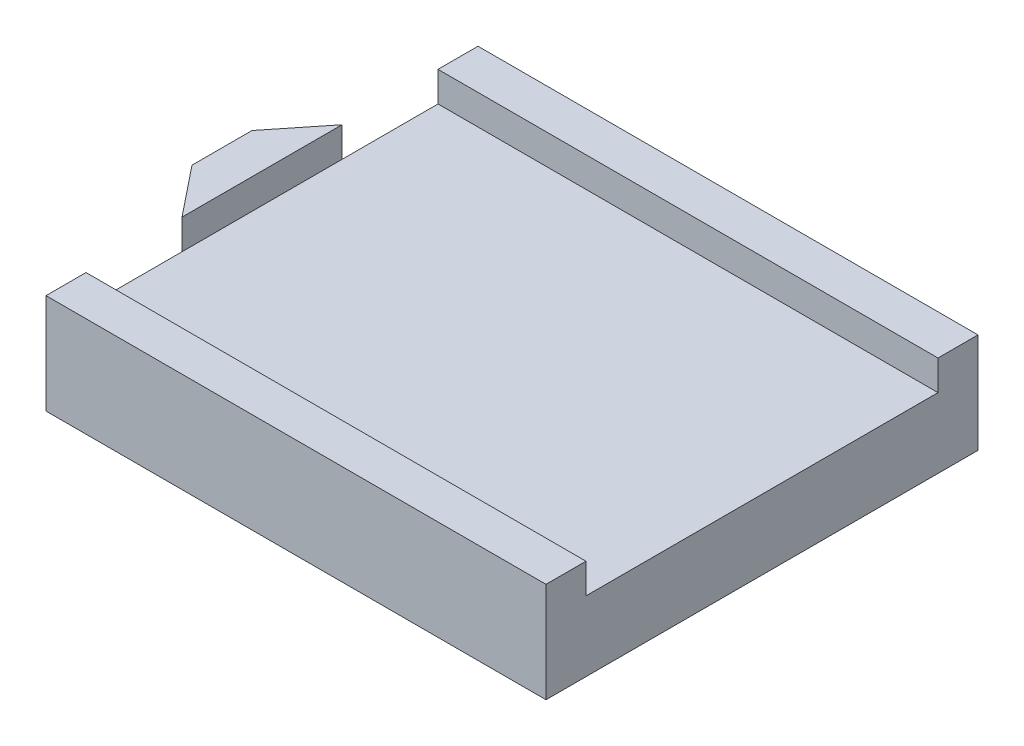
ISO-10303-21;
HEADER;
FILE_DESCRIPTION(('STEP AP214'),'2;1');
FILE_NAME('part.step','',(''),(''),'','','');
FILE_SCHEMA(('AUTOMOTIVE_DESIGN { 1 0 10303 214 1 1 1 1 }'));
ENDSEC;
DATA;
#1=APPLICATION_CONTEXT('core data for automotive mechanical design processes');
#2=APPLICATION_PROTOCOL_DEFINITION('international standard','automotive_design',2000,#1);
#3=PRODUCT_CONTEXT('',#1,'mechanical');
#4=PRODUCT('Part','Part','',(#3));
#5=PRODUCT_RELATED_PRODUCT_CATEGORY('part','',(#4));
#6=PRODUCT_DEFINITION_FORMATION('','',#4);
#7=PRODUCT_DEFINITION_CONTEXT('part definition',#1,'design');
#8=PRODUCT_DEFINITION('design','',#6,#7);
#9=PRODUCT_DEFINITION_SHAPE('','',#8);
#10=(LENGTH_UNIT() NAMED_UNIT(*) SI_UNIT(.MILLI.,.METRE.));
#11=(NAMED_UNIT(*) PLANE_ANGLE_UNIT() SI_UNIT($,.RADIAN.));
#12=(NAMED_UNIT(*) SI_UNIT($,.STERADIAN.) SOLID_ANGLE_UNIT());
#13=UNCERTAINTY_MEASURE_WITH_UNIT(LENGTH_MEASURE(1.E-05),#10,'distance_accuracy_value','');
#14=(GEOMETRIC_REPRESENTATION_CONTEXT(3) GLOBAL_UNCERTAINTY_ASSIGNED_CONTEXT((#13)) GLOBAL_UNIT_ASSIGNED_CONTEXT((#10,
#11,#12)) REPRESENTATION_CONTEXT('',''));
#15=CARTESIAN_POINT('',(0.,0.,0.));
#16=DIRECTION('',(0.,0.,1.));
#17=DIRECTION('',(1.,0.,0.));
#18=AXIS2_PLACEMENT_3D('',#15,#16,#17);
#19=CARTESIAN_POINT('',(-12.5,3.5,0.));
#20=DIRECTION('',(-1.,0.,0.));
#21=DIRECTION('',(0.,0.,1.));
#22=AXIS2_PLACEMENT_3D('',#19,#20,#21);
#23=PLANE('',#22);
#24=DIRECTION('',(0.,0.,-1.));
#25=VECTOR('',#24,1.);
#26=CARTESIAN_POINT('',(-12.5,3.5,0.));
#27=LINE('',#26,#25);
#28=CARTESIAN_POINT('',(-12.5,3.5,8.8));
#29=VERTEX_POINT('',#28);
#30=CARTESIAN_POINT('',(-12.5,3.5,4.));
#31=VERTEX_POINT('',#30);
#32=EDGE_CURVE('E262',#29,#31,#27,.T.);
#33=ORIENTED_EDGE('',*,*,#32,.T.);
#34=DIRECTION('',(0.,-1.,0.));
#35=VECTOR('',#34,1.);
#36=CARTESIAN_POINT('',(-12.5,5.,4.));
#37=LINE('',#36,#35);
#38=CARTESIAN_POINT('',(-12.5,0.,4.));
#39=VERTEX_POINT('',#38);
#40=EDGE_CURVE('E56',#31,#39,#37,.T.);
#41=ORIENTED_EDGE('',*,*,#40,.T.);
#42=DIRECTION('',(0.,0.,-1.));
#43=VECTOR('',#42,1.);
#44=CARTESIAN_POINT('',(-12.5,0.,0.));
#45=LINE('',#44,#43);
#46=CARTESIAN_POINT('',(-12.5,0.,10.8));
#47=VERTEX_POINT('',#46);
#48=EDGE_CURVE('E278',#47,#39,#45,.T.);
#49=ORIENTED_EDGE('',*,*,#48,.F.);
#50=DIRECTION('',(0.,-1.,0.));
#51=VECTOR('',#50,1.);
#52=CARTESIAN_POINT('',(-12.5,5.,10.8));
#53=LINE('',#52,#51);
#54=CARTESIAN_POINT('',(-12.5,5.,10.8));
#55=VERTEX_POINT('',#54);
#56=EDGE_CURVE('E253',#55,#47,#53,.T.);
#57=ORIENTED_EDGE('',*,*,#56,.F.);
#58=DIRECTION('',(0.,0.,-1.));
#59=VECTOR('',#58,1.);
#60=CARTESIAN_POINT('',(-12.5,5.,0.));
#61=LINE('',#60,#59);
#62=CARTESIAN_POINT('',(-12.5,5.,8.8));
#63=VERTEX_POINT('',#62);
#64=EDGE_CURVE('E232',#55,#63,#61,.T.);
#65=ORIENTED_EDGE('',*,*,#64,.T.);
#66=DIRECTION('',(0.,-1.,0.));
#67=VECTOR('',#66,1.);
#68=CARTESIAN_POINT('',(-12.5,5.,8.8));
#69=LINE('',#68,#67);
#70=EDGE_CURVE('E257',#63,#29,#69,.T.);
#71=ORIENTED_EDGE('',*,*,#70,.T.);
#72=EDGE_LOOP('',(#33,#41,#49,#57,#65,#71));
#73=FACE_BOUND('',#72,.T.);
#74=ADVANCED_FACE('F46',(#73),#23,.T.);
#75=DIRECTION('',(0.,-1.,0.));
#76=VECTOR('',#75,1.);
#77=CARTESIAN_POINT('',(-12.5,5.,-4.));
#78=LINE('',#77,#76);
#79=CARTESIAN_POINT('',(-12.5,3.5,-4.));
#80=VERTEX_POINT('',#79);
#81=CARTESIAN_POINT('',(-12.5,0.,-4.));
#82=VERTEX_POINT('',#81);
#83=EDGE_CURVE('E11',#80,#82,#78,.T.);
#84=ORIENTED_EDGE('',*,*,#83,.F.);
#85=CARTESIAN_POINT('',(-12.5,3.5,-8.8));
#86=VERTEX_POINT('',#85);
#87=EDGE_CURVE('E73',#80,#86,#27,.T.);
#88=ORIENTED_EDGE('',*,*,#87,.T.);
#89=DIRECTION('',(0.,-1.,0.));
#90=VECTOR('',#89,1.);
#91=CARTESIAN_POINT('',(-12.5,5.,-8.8));
#92=LINE('',#91,#90);
#93=CARTESIAN_POINT('',(-12.5,5.,-8.8));
#94=VERTEX_POINT('',#93);
#95=EDGE_CURVE('E224',#94,#86,#92,.T.);
#96=ORIENTED_EDGE('',*,*,#95,.F.);
#97=DIRECTION('',(0.,0.,-1.));
#98=VECTOR('',#97,1.);
#99=CARTESIAN_POINT('',(-12.5,5.,0.));
#100=LINE('',#99,#98);
#101=CARTESIAN_POINT('',(-12.5,5.,-10.8));
#102=VERTEX_POINT('',#101);
#103=EDGE_CURVE('E195',#94,#102,#100,.T.);
#104=ORIENTED_EDGE('',*,*,#103,.T.);
#105=DIRECTION('',(0.,-1.,0.));
#106=VECTOR('',#105,1.);
#107=CARTESIAN_POINT('',(-12.5,5.,-10.8));
#108=LINE('',#107,#106);
#109=CARTESIAN_POINT('',(-12.5,0.,-10.8));
#110=VERTEX_POINT('',#109);
#111=EDGE_CURVE('E209',#102,#110,#108,.T.);
#112=ORIENTED_EDGE('',*,*,#111,.T.);
#113=EDGE_CURVE('E261',#82,#110,#45,.T.);
#114=ORIENTED_EDGE('',*,*,#113,.F.);
#115=EDGE_LOOP('',(#84,#88,#96,#104,#112,#114));
#116=FACE_BOUND('',#115,.T.);
#117=ADVANCED_FACE('F48',(#116),#23,.T.);
#118=CARTESIAN_POINT('',(12.5,3.5,0.));
#119=DIRECTION('',(-1.,0.,0.));
#120=DIRECTION('',(0.,0.,1.));
#121=AXIS2_PLACEMENT_3D('',#118,#119,#120);
#122=PLANE('',#121);
#123=DIRECTION('',(0.,0.,-1.));
#124=VECTOR('',#123,1.);
#125=CARTESIAN_POINT('',(12.5,0.,0.));
#126=LINE('',#125,#124);
#127=CARTESIAN_POINT('',(12.5,0.,10.8));
#128=VERTEX_POINT('',#127);
#129=CARTESIAN_POINT('',(12.5,0.,-10.8));
#130=VERTEX_POINT('',#129);
#131=EDGE_CURVE('E50',#128,#130,#126,.T.);
#132=ORIENTED_EDGE('',*,*,#131,.T.);
#133=DIRECTION('',(0.,-1.,0.));
#134=VECTOR('',#133,1.);
#135=CARTESIAN_POINT('',(12.5,5.,-10.8));
#136=LINE('',#135,#134);
#137=CARTESIAN_POINT('',(12.5,5.,-10.8));
#138=VERTEX_POINT('',#137);
#139=EDGE_CURVE('E216',#138,#130,#136,.T.);
#140=ORIENTED_EDGE('',*,*,#139,.F.);
#141=DIRECTION('',(0.,0.,-1.));
#142=VECTOR('',#141,1.);
#143=CARTESIAN_POINT('',(12.5,5.,0.));
#144=LINE('',#143,#142);
#145=CARTESIAN_POINT('',(12.5,5.,-8.8));
#146=VERTEX_POINT('',#145);
#147=EDGE_CURVE('E203',#146,#138,#144,.T.);
#148=ORIENTED_EDGE('',*,*,#147,.F.);
#149=DIRECTION('',(0.,-1.,0.));
#150=VECTOR('',#149,1.);
#151=CARTESIAN_POINT('',(12.5,5.,-8.8));
#152=LINE('',#151,#150);
#153=CARTESIAN_POINT('',(12.5,3.5,-8.8));
#154=VERTEX_POINT('',#153);
#155=EDGE_CURVE('E220',#146,#154,#152,.T.);
#156=ORIENTED_EDGE('',*,*,#155,.T.);
#157=DIRECTION('',(0.,0.,-1.));
#158=VECTOR('',#157,1.);
#159=CARTESIAN_POINT('',(12.5,3.5,0.));
#160=LINE('',#159,#158);
#161=CARTESIAN_POINT('',(12.5,3.5,8.8));
#162=VERTEX_POINT('',#161);
#163=EDGE_CURVE('E271',#162,#154,#160,.T.);
#164=ORIENTED_EDGE('',*,*,#163,.F.);
#165=DIRECTION('',(0.,-1.,0.));
#166=VECTOR('',#165,1.);
#167=CARTESIAN_POINT('',(12.5,5.,8.8));
#168=LINE('',#167,#166);
#169=CARTESIAN_POINT('',(12.5,5.,8.8));
#170=VERTEX_POINT('',#169);
#171=EDGE_CURVE('E243',#170,#162,#168,.T.);
#172=ORIENTED_EDGE('',*,*,#171,.F.);
#173=DIRECTION('',(0.,0.,-1.));
#174=VECTOR('',#173,1.);
#175=CARTESIAN_POINT('',(12.5,5.,0.));
#176=LINE('',#175,#174);
#177=CARTESIAN_POINT('',(12.5,5.,10.8));
#178=VERTEX_POINT('',#177);
#179=EDGE_CURVE('E240',#178,#170,#176,.T.);
#180=ORIENTED_EDGE('',*,*,#179,.F.);
#181=DIRECTION('',(0.,-1.,0.));
#182=VECTOR('',#181,1.);
#183=CARTESIAN_POINT('',(12.5,5.,10.8));
#184=LINE('',#183,#182);
#185=EDGE_CURVE('E249',#178,#128,#184,.T.);
#186=ORIENTED_EDGE('',*,*,#185,.T.);
#187=EDGE_LOOP('',(#132,#140,#148,#156,#164,#172,#180,#186));
#188=FACE_BOUND('',#187,.T.);
#189=ADVANCED_FACE('F295',(#188),#122,.F.);
#190=CARTESIAN_POINT('',(0.,3.5,0.));
#191=DIRECTION('',(0.,1.,0.));
#192=DIRECTION('',(0.,0.,1.));
#193=AXIS2_PLACEMENT_3D('',#190,#191,#192);
#194=PLANE('',#193);
#195=ORIENTED_EDGE('',*,*,#32,.F.);
#196=DIRECTION('',(1.,0.,0.));
#197=VECTOR('',#196,1.);
#198=CARTESIAN_POINT('',(0.,3.5,8.8));
#199=LINE('',#198,#197);
#200=EDGE_CURVE('E266',#29,#162,#199,.T.);
#201=ORIENTED_EDGE('',*,*,#200,.T.);
#202=ORIENTED_EDGE('',*,*,#163,.T.);
#203=DIRECTION('',(-1.,0.,0.));
#204=VECTOR('',#203,1.);
#205=CARTESIAN_POINT('',(0.,3.5,-8.8));
#206=LINE('',#205,#204);
#207=EDGE_CURVE('E275',#154,#86,#206,.T.);
#208=ORIENTED_EDGE('',*,*,#207,.T.);
#209=ORIENTED_EDGE('',*,*,#87,.F.);
#210=EDGE_CURVE('E267',#31,#80,#27,.T.);
#211=ORIENTED_EDGE('',*,*,#210,.F.);
#212=EDGE_LOOP('',(#195,#201,#202,#208,#209,#211));
#213=FACE_BOUND('',#212,.T.);
#214=ADVANCED_FACE('F313',(#213),#194,.T.);
#215=CARTESIAN_POINT('',(0.,0.,0.));
#216=DIRECTION('',(0.,1.,0.));
#217=DIRECTION('',(0.,0.,1.));
#218=AXIS2_PLACEMENT_3D('',#215,#216,#217);
#219=PLANE('',#218);
#220=CARTESIAN_POINT('',(8.50000000000002,0.,-7.8));
#221=DIRECTION('',(0.,-1.,0.));
#222=DIRECTION('',(0.,0.,1.));
#223=AXIS2_PLACEMENT_3D('',#220,#221,#222);
#224=CIRCLE('',#223,1.55);
#225=CARTESIAN_POINT('',(8.50000000000002,0.,-6.25));
#226=VERTEX_POINT('',#225);
#227=EDGE_CURVE('E426',#226,#226,#224,.T.);
#228=ORIENTED_EDGE('',*,*,#227,.F.);
#229=EDGE_LOOP('',(#228));
#230=FACE_BOUND('',#229,.T.);
#231=CARTESIAN_POINT('',(-8.49999999999999,0.,-7.80000000000003));
#232=DIRECTION('',(0.,-1.,0.));
#233=DIRECTION('',(0.,0.,-1.));
#234=AXIS2_PLACEMENT_3D('',#231,#232,#233);
#235=CIRCLE('',#234,1.55);
#236=CARTESIAN_POINT('',(-8.49999999999999,0.,-9.35000000000002));
#237=VERTEX_POINT('',#236);
#238=EDGE_CURVE('E416',#237,#237,#235,.T.);
#239=ORIENTED_EDGE('',*,*,#238,.F.);
#240=EDGE_LOOP('',(#239));
#241=FACE_BOUND('',#240,.T.);
#242=CARTESIAN_POINT('',(-8.49999999999999,0.,7.80000000000002));
#243=DIRECTION('',(0.,-1.,0.));
#244=DIRECTION('',(0.,0.,1.));
#245=AXIS2_PLACEMENT_3D('',#242,#243,#244);
#246=CIRCLE('',#245,1.55);
#247=CARTESIAN_POINT('',(-8.49999999999999,0.,9.35000000000002));
#248=VERTEX_POINT('',#247);
#249=EDGE_CURVE('E408',#248,#248,#246,.T.);
#250=ORIENTED_EDGE('',*,*,#249,.F.);
#251=EDGE_LOOP('',(#250));
#252=FACE_BOUND('',#251,.T.);
#253=CARTESIAN_POINT('',(8.50000000000001,0.,7.80000000000001));
#254=DIRECTION('',(0.,-1.,0.));
#255=DIRECTION('',(0.,0.,-1.));
#256=AXIS2_PLACEMENT_3D('',#253,#254,#255);
#257=CIRCLE('',#256,1.55);
#258=CARTESIAN_POINT('',(8.50000000000001,0.,6.25000000000001));
#259=VERTEX_POINT('',#258);
#260=EDGE_CURVE('E411',#259,#259,#257,.T.);
#261=ORIENTED_EDGE('',*,*,#260,.F.);
#262=EDGE_LOOP('',(#261));
#263=FACE_BOUND('',#262,.T.);
#264=ORIENTED_EDGE('',*,*,#48,.T.);
#265=DIRECTION('',(0.624695047554424,0.,0.78086880944303));
#266=VECTOR('',#265,1.);
#267=CARTESIAN_POINT('',(-9.57317073170731,0.,7.65853658536585));
#268=LINE('',#267,#266);
#269=CARTESIAN_POINT('',(-14.5,0.,1.5));
#270=VERTEX_POINT('',#269);
#271=EDGE_CURVE('E65',#270,#39,#268,.T.);
#272=ORIENTED_EDGE('',*,*,#271,.F.);
#273=DIRECTION('',(0.,0.,-1.));
#274=VECTOR('',#273,1.);
#275=CARTESIAN_POINT('',(-14.5,0.,0.));
#276=LINE('',#275,#274);
#277=CARTESIAN_POINT('',(-14.5,0.,-1.5));
#278=VERTEX_POINT('',#277);
#279=EDGE_CURVE('E182',#270,#278,#276,.T.);
#280=ORIENTED_EDGE('',*,*,#279,.T.);
#281=DIRECTION('',(0.624695047554424,0.,-0.78086880944303));
#282=VECTOR('',#281,1.);
#283=CARTESIAN_POINT('',(-9.57317073170731,0.,-7.65853658536585));
#284=LINE('',#283,#282);
#285=EDGE_CURVE('E151',#278,#82,#284,.T.);
#286=ORIENTED_EDGE('',*,*,#285,.T.);
#287=ORIENTED_EDGE('',*,*,#113,.T.);
#288=DIRECTION('',(-1.,0.,0.));
#289=VECTOR('',#288,1.);
#290=CARTESIAN_POINT('',(0.,0.,-10.8));
#291=LINE('',#290,#289);
#292=EDGE_CURVE('E157',#130,#110,#291,.T.);
#293=ORIENTED_EDGE('',*,*,#292,.F.);
#294=ORIENTED_EDGE('',*,*,#131,.F.);
#295=DIRECTION('',(-1.,0.,0.));
#296=VECTOR('',#295,1.);
#297=CARTESIAN_POINT('',(0.,0.,10.8));
#298=LINE('',#297,#296);
#299=EDGE_CURVE('E227',#128,#47,#298,.T.);
#300=ORIENTED_EDGE('',*,*,#299,.T.);
#301=EDGE_LOOP('',(#264,#272,#280,#286,#287,#293,#294,#300));
#302=FACE_BOUND('',#301,.T.);
#303=ADVANCED_FACE('F286',(#230,#241,#252,#263,#302),#219,.F.);
#304=CARTESIAN_POINT('',(0.,5.,8.8));
#305=DIRECTION('',(0.,0.,-1.));
#306=DIRECTION('',(-1.,0.,0.));
#307=AXIS2_PLACEMENT_3D('',#304,#305,#306);
#308=PLANE('',#307);
#309=ORIENTED_EDGE('',*,*,#200,.F.);
#310=ORIENTED_EDGE('',*,*,#70,.F.);
#311=DIRECTION('',(1.,0.,0.));
#312=VECTOR('',#311,1.);
#313=CARTESIAN_POINT('',(0.,5.,8.8));
#314=LINE('',#313,#312);
#315=EDGE_CURVE('E228',#63,#170,#314,.T.);
#316=ORIENTED_EDGE('',*,*,#315,.T.);
#317=ORIENTED_EDGE('',*,*,#171,.T.);
#318=EDGE_LOOP('',(#309,#310,#316,#317));
#319=FACE_BOUND('',#318,.T.);
#320=ADVANCED_FACE('F309',(#319),#308,.T.);
#321=CARTESIAN_POINT('',(0.,5.,10.8));
#322=DIRECTION('',(0.,0.,1.));
#323=DIRECTION('',(1.,0.,0.));
#324=AXIS2_PLACEMENT_3D('',#321,#322,#323);
#325=PLANE('',#324);
#326=ORIENTED_EDGE('',*,*,#299,.F.);
#327=ORIENTED_EDGE('',*,*,#185,.F.);
#328=DIRECTION('',(-1.,0.,0.));
#329=VECTOR('',#328,1.);
#330=CARTESIAN_POINT('',(0.,5.,10.8));
#331=LINE('',#330,#329);
#332=EDGE_CURVE('E236',#178,#55,#331,.T.);
#333=ORIENTED_EDGE('',*,*,#332,.T.);
#334=ORIENTED_EDGE('',*,*,#56,.T.);
#335=EDGE_LOOP('',(#326,#327,#333,#334));
#336=FACE_BOUND('',#335,.T.);
#337=ADVANCED_FACE('F300',(#336),#325,.T.);
#338=CARTESIAN_POINT('',(0.,5.,0.));
#339=DIRECTION('',(0.,1.,0.));
#340=DIRECTION('',(0.,0.,1.));
#341=AXIS2_PLACEMENT_3D('',#338,#339,#340);
#342=PLANE('',#341);
#343=ORIENTED_EDGE('',*,*,#315,.F.);
#344=ORIENTED_EDGE('',*,*,#64,.F.);
#345=ORIENTED_EDGE('',*,*,#332,.F.);
#346=ORIENTED_EDGE('',*,*,#179,.T.);
#347=EDGE_LOOP('',(#343,#344,#345,#346));
#348=FACE_BOUND('',#347,.T.);
#349=ADVANCED_FACE('F306',(#348),#342,.T.);
#350=CARTESIAN_POINT('',(0.,5.,-8.8));
#351=DIRECTION('',(0.,0.,1.));
#352=DIRECTION('',(1.,0.,0.));
#353=AXIS2_PLACEMENT_3D('',#350,#351,#352);
#354=PLANE('',#353);
#355=ORIENTED_EDGE('',*,*,#207,.F.);
#356=ORIENTED_EDGE('',*,*,#155,.F.);
#357=DIRECTION('',(-1.,0.,0.));
#358=VECTOR('',#357,1.);
#359=CARTESIAN_POINT('',(0.,5.,-8.8));
#360=LINE('',#359,#358);
#361=EDGE_CURVE('E199',#146,#94,#360,.T.);
#362=ORIENTED_EDGE('',*,*,#361,.T.);
#363=ORIENTED_EDGE('',*,*,#95,.T.);
#364=EDGE_LOOP('',(#355,#356,#362,#363));
#365=FACE_BOUND('',#364,.T.);
#366=ADVANCED_FACE('F355',(#365),#354,.T.);
#367=CARTESIAN_POINT('',(0.,5.,-10.8));
#368=DIRECTION('',(0.,0.,1.));
#369=DIRECTION('',(1.,0.,0.));
#370=AXIS2_PLACEMENT_3D('',#367,#368,#369);
#371=PLANE('',#370);
#372=ORIENTED_EDGE('',*,*,#292,.T.);
#373=ORIENTED_EDGE('',*,*,#111,.F.);
#374=DIRECTION('',(-1.,0.,0.));
#375=VECTOR('',#374,1.);
#376=CARTESIAN_POINT('',(0.,5.,-10.8));
#377=LINE('',#376,#375);
#378=EDGE_CURVE('E206',#138,#102,#377,.T.);
#379=ORIENTED_EDGE('',*,*,#378,.F.);
#380=ORIENTED_EDGE('',*,*,#139,.T.);
#381=EDGE_LOOP('',(#372,#373,#379,#380));
#382=FACE_BOUND('',#381,.T.);
#383=ADVANCED_FACE('F291',(#382),#371,.F.);
#384=CARTESIAN_POINT('',(0.,5.,0.));
#385=DIRECTION('',(0.,1.,0.));
#386=DIRECTION('',(0.,0.,1.));
#387=AXIS2_PLACEMENT_3D('',#384,#385,#386);
#388=PLANE('',#387);
#389=ORIENTED_EDGE('',*,*,#103,.F.);
#390=ORIENTED_EDGE('',*,*,#361,.F.);
#391=ORIENTED_EDGE('',*,*,#147,.T.);
#392=ORIENTED_EDGE('',*,*,#378,.T.);
#393=EDGE_LOOP('',(#389,#390,#391,#392));
#394=FACE_BOUND('',#393,.T.);
#395=ADVANCED_FACE('F323',(#394),#388,.T.);
#396=CARTESIAN_POINT('',(-12.5,5.,0.));
#397=DIRECTION('',(-1.,0.,0.));
#398=DIRECTION('',(0.,0.,1.));
#399=AXIS2_PLACEMENT_3D('',#396,#397,#398);
#400=PLANE('',#399);
#401=CARTESIAN_POINT('',(-12.5,5.,4.));
#402=VERTEX_POINT('',#401);
#403=EDGE_CURVE('E189',#402,#31,#37,.T.);
#404=ORIENTED_EDGE('',*,*,#403,.T.);
#405=ORIENTED_EDGE('',*,*,#210,.T.);
#406=CARTESIAN_POINT('',(-12.5,5.,-4.));
#407=VERTEX_POINT('',#406);
#408=EDGE_CURVE('E58',#407,#80,#78,.T.);
#409=ORIENTED_EDGE('',*,*,#408,.F.);
#410=DIRECTION('',(0.,0.,-1.));
#411=VECTOR('',#410,1.);
#412=CARTESIAN_POINT('',(-12.5,5.,0.));
#413=LINE('',#412,#411);
#414=EDGE_CURVE('E165',#402,#407,#413,.T.);
#415=ORIENTED_EDGE('',*,*,#414,.F.);
#416=EDGE_LOOP('',(#404,#405,#409,#415));
#417=FACE_BOUND('',#416,.T.);
#418=ADVANCED_FACE('F321',(#417),#400,.F.);
#419=CARTESIAN_POINT('',(-9.57317073170731,5.,-7.65853658536585));
#420=DIRECTION('',(-0.78086880944303,0.,-0.624695047554424));
#421=DIRECTION('',(-0.624695047554424,0.,0.78086880944303));
#422=AXIS2_PLACEMENT_3D('',#419,#420,#421);
#423=PLANE('',#422);
#424=ORIENTED_EDGE('',*,*,#285,.F.);
#425=DIRECTION('',(0.,-1.,0.));
#426=VECTOR('',#425,1.);
#427=CARTESIAN_POINT('',(-14.5,5.,-1.5));
#428=LINE('',#427,#426);
#429=CARTESIAN_POINT('',(-14.5,5.,-1.5));
#430=VERTEX_POINT('',#429);
#431=EDGE_CURVE('E145',#430,#278,#428,.T.);
#432=ORIENTED_EDGE('',*,*,#431,.F.);
#433=DIRECTION('',(0.624695047554424,0.,-0.78086880944303));
#434=VECTOR('',#433,1.);
#435=CARTESIAN_POINT('',(-9.57317073170731,5.,-7.65853658536585));
#436=LINE('',#435,#434);
#437=EDGE_CURVE('E149',#430,#407,#436,.T.);
#438=ORIENTED_EDGE('',*,*,#437,.T.);
#439=ORIENTED_EDGE('',*,*,#408,.T.);
#440=ORIENTED_EDGE('',*,*,#83,.T.);
#441=EDGE_LOOP('',(#424,#432,#438,#439,#440));
#442=FACE_BOUND('',#441,.T.);
#443=ADVANCED_FACE('F147',(#442),#423,.T.);
#444=CARTESIAN_POINT('',(-14.5,5.,0.));
#445=DIRECTION('',(-1.,0.,0.));
#446=DIRECTION('',(0.,0.,1.));
#447=AXIS2_PLACEMENT_3D('',#444,#445,#446);
#448=PLANE('',#447);
#449=ORIENTED_EDGE('',*,*,#279,.F.);
#450=DIRECTION('',(0.,-1.,0.));
#451=VECTOR('',#450,1.);
#452=CARTESIAN_POINT('',(-14.5,5.,1.5));
#453=LINE('',#452,#451);
#454=CARTESIAN_POINT('',(-14.5,5.,1.5));
#455=VERTEX_POINT('',#454);
#456=EDGE_CURVE('E158',#455,#270,#453,.T.);
#457=ORIENTED_EDGE('',*,*,#456,.F.);
#458=DIRECTION('',(0.,0.,-1.));
#459=VECTOR('',#458,1.);
#460=CARTESIAN_POINT('',(-14.5,5.,0.));
#461=LINE('',#460,#459);
#462=EDGE_CURVE('E163',#455,#430,#461,.T.);
#463=ORIENTED_EDGE('',*,*,#462,.T.);
#464=ORIENTED_EDGE('',*,*,#431,.T.);
#465=EDGE_LOOP('',(#449,#457,#463,#464));
#466=FACE_BOUND('',#465,.T.);
#467=ADVANCED_FACE('F169',(#466),#448,.T.);
#468=CARTESIAN_POINT('',(-9.57317073170731,5.,7.65853658536585));
#469=DIRECTION('',(0.78086880944303,0.,-0.624695047554424));
#470=DIRECTION('',(-0.624695047554424,0.,-0.78086880944303));
#471=AXIS2_PLACEMENT_3D('',#468,#469,#470);
#472=PLANE('',#471);
#473=ORIENTED_EDGE('',*,*,#271,.T.);
#474=ORIENTED_EDGE('',*,*,#40,.F.);
#475=ORIENTED_EDGE('',*,*,#403,.F.);
#476=DIRECTION('',(0.624695047554424,0.,0.78086880944303));
#477=VECTOR('',#476,1.);
#478=CARTESIAN_POINT('',(-9.57317073170731,5.,7.65853658536585));
#479=LINE('',#478,#477);
#480=EDGE_CURVE('E172',#455,#402,#479,.T.);
#481=ORIENTED_EDGE('',*,*,#480,.F.);
#482=ORIENTED_EDGE('',*,*,#456,.T.);
#483=EDGE_LOOP('',(#473,#474,#475,#481,#482));
#484=FACE_BOUND('',#483,.T.);
#485=ADVANCED_FACE('F320',(#484),#472,.F.);
#486=CARTESIAN_POINT('',(0.,5.,0.));
#487=DIRECTION('',(0.,1.,0.));
#488=DIRECTION('',(0.,0.,1.));
#489=AXIS2_PLACEMENT_3D('',#486,#487,#488);
#490=PLANE('',#489);
#491=ORIENTED_EDGE('',*,*,#437,.F.);
#492=ORIENTED_EDGE('',*,*,#462,.F.);
#493=ORIENTED_EDGE('',*,*,#480,.T.);
#494=ORIENTED_EDGE('',*,*,#414,.T.);
#495=EDGE_LOOP('',(#491,#492,#493,#494));
#496=FACE_BOUND('',#495,.T.);
#497=ADVANCED_FACE('F162',(#496),#490,.T.);
#498=CARTESIAN_POINT('',(8.50000000000001,2.2,7.80000000000001));
#499=DIRECTION('',(0.,-1.,0.));
#500=DIRECTION('',(0.,0.,-1.));
#501=AXIS2_PLACEMENT_3D('',#498,#499,#500);
#502=CYLINDRICAL_SURFACE('',#501,1.55);
#503=CARTESIAN_POINT('',(8.50000000000001,2.2,7.80000000000001));
#504=DIRECTION('',(0.,-1.,0.));
#505=DIRECTION('',(0.,0.,-1.));
#506=AXIS2_PLACEMENT_3D('',#503,#504,#505);
#507=CIRCLE('',#506,1.55);
#508=CARTESIAN_POINT('',(8.50000000000001,2.2,6.25000000000001));
#509=VERTEX_POINT('',#508);
#510=EDGE_CURVE('E183',#509,#509,#507,.T.);
#511=ORIENTED_EDGE('',*,*,#510,.F.);
#512=EDGE_LOOP('',(#511));
#513=FACE_BOUND('',#512,.T.);
#514=ORIENTED_EDGE('',*,*,#260,.T.);
#515=EDGE_LOOP('',(#514));
#516=FACE_BOUND('',#515,.T.);
#517=ADVANCED_FACE('F366',(#513,#516),#502,.F.);
#518=CARTESIAN_POINT('',(8.50000000000001,2.2,7.80000000000001));
#519=DIRECTION('',(0.,-1.,0.));
#520=DIRECTION('',(0.,0.,-1.));
#521=AXIS2_PLACEMENT_3D('',#518,#519,#520);
#522=PLANE('',#521);
#523=ORIENTED_EDGE('',*,*,#510,.T.);
#524=EDGE_LOOP('',(#523));
#525=FACE_BOUND('',#524,.T.);
#526=ADVANCED_FACE('F370',(#525),#522,.T.);
#527=CARTESIAN_POINT('',(-8.49999999999999,2.2,7.80000000000002));
#528=DIRECTION('',(0.,-1.,0.));
#529=DIRECTION('',(0.,0.,-1.));
#530=AXIS2_PLACEMENT_3D('',#527,#528,#529);
#531=CYLINDRICAL_SURFACE('',#530,1.55);
#532=CARTESIAN_POINT('',(-8.49999999999999,2.2,7.80000000000002));
#533=DIRECTION('',(0.,-1.,0.));
#534=DIRECTION('',(0.,0.,1.));
#535=AXIS2_PLACEMENT_3D('',#532,#533,#534);
#536=CIRCLE('',#535,1.55);
#537=CARTESIAN_POINT('',(-8.49999999999999,2.2,9.35000000000002));
#538=VERTEX_POINT('',#537);
#539=EDGE_CURVE('E405',#538,#538,#536,.T.);
#540=ORIENTED_EDGE('',*,*,#539,.F.);
#541=EDGE_LOOP('',(#540));
#542=FACE_BOUND('',#541,.T.);
#543=ORIENTED_EDGE('',*,*,#249,.T.);
#544=EDGE_LOOP('',(#543));
#545=FACE_BOUND('',#544,.T.);
#546=ADVANCED_FACE('F376',(#542,#545),#531,.F.);
#547=CARTESIAN_POINT('',(-8.49999999999999,2.2,7.80000000000002));
#548=DIRECTION('',(0.,1.,0.));
#549=DIRECTION('',(0.,0.,1.));
#550=AXIS2_PLACEMENT_3D('',#547,#548,#549);
#551=PLANE('',#550);
#552=ORIENTED_EDGE('',*,*,#539,.T.);
#553=EDGE_LOOP('',(#552));
#554=FACE_BOUND('',#553,.T.);
#555=ADVANCED_FACE('F393',(#554),#551,.F.);
#556=CARTESIAN_POINT('',(-8.49999999999999,2.2,-7.80000000000003));
#557=DIRECTION('',(0.,-1.,0.));
#558=DIRECTION('',(0.,0.,-1.));
#559=AXIS2_PLACEMENT_3D('',#556,#557,#558);
#560=CYLINDRICAL_SURFACE('',#559,1.55);
#561=CARTESIAN_POINT('',(-8.49999999999999,2.2,-7.80000000000003));
#562=DIRECTION('',(0.,-1.,0.));
#563=DIRECTION('',(0.,0.,-1.));
#564=AXIS2_PLACEMENT_3D('',#561,#562,#563);
#565=CIRCLE('',#564,1.55);
#566=CARTESIAN_POINT('',(-8.49999999999999,2.2,-9.35000000000002));
#567=VERTEX_POINT('',#566);
#568=EDGE_CURVE('E422',#567,#567,#565,.T.);
#569=ORIENTED_EDGE('',*,*,#568,.F.);
#570=EDGE_LOOP('',(#569));
#571=FACE_BOUND('',#570,.T.);
#572=ORIENTED_EDGE('',*,*,#238,.T.);
#573=EDGE_LOOP('',(#572));
#574=FACE_BOUND('',#573,.T.);
#575=ADVANCED_FACE('F389',(#571,#574),#560,.F.);
#576=CARTESIAN_POINT('',(-8.49999999999999,2.2,-7.80000000000003));
#577=DIRECTION('',(0.,-1.,0.));
#578=DIRECTION('',(0.,0.,-1.));
#579=AXIS2_PLACEMENT_3D('',#576,#577,#578);
#580=PLANE('',#579);
#581=ORIENTED_EDGE('',*,*,#568,.T.);
#582=EDGE_LOOP('',(#581));
#583=FACE_BOUND('',#582,.T.);
#584=ADVANCED_FACE('F385',(#583),#580,.T.);
#585=CARTESIAN_POINT('',(8.50000000000002,2.2,-7.8));
#586=DIRECTION('',(0.,-1.,0.));
#587=DIRECTION('',(0.,0.,-1.));
#588=AXIS2_PLACEMENT_3D('',#585,#586,#587);
#589=CYLINDRICAL_SURFACE('',#588,1.55);
#590=CARTESIAN_POINT('',(8.50000000000002,2.2,-7.8));
#591=DIRECTION('',(0.,-1.,0.));
#592=DIRECTION('',(0.,0.,1.));
#593=AXIS2_PLACEMENT_3D('',#590,#591,#592);
#594=CIRCLE('',#593,1.55);
#595=CARTESIAN_POINT('',(8.50000000000002,2.2,-6.25));
#596=VERTEX_POINT('',#595);
#597=EDGE_CURVE('E430',#596,#596,#594,.T.);
#598=ORIENTED_EDGE('',*,*,#597,.F.);
#599=EDGE_LOOP('',(#598));
#600=FACE_BOUND('',#599,.T.);
#601=ORIENTED_EDGE('',*,*,#227,.T.);
#602=EDGE_LOOP('',(#601));
#603=FACE_BOUND('',#602,.T.);
#604=ADVANCED_FACE('F381',(#600,#603),#589,.F.);
#605=CARTESIAN_POINT('',(8.50000000000002,2.2,-7.8));
#606=DIRECTION('',(0.,1.,0.));
#607=DIRECTION('',(0.,0.,1.));
#608=AXIS2_PLACEMENT_3D('',#605,#606,#607);
#609=PLANE('',#608);
#610=ORIENTED_EDGE('',*,*,#597,.T.);
#611=EDGE_LOOP('',(#610));
#612=FACE_BOUND('',#611,.T.);
#613=ADVANCED_FACE('F378',(#612),#609,.F.);
#614=CLOSED_SHELL('',(#74,#117,#189,#214,#303,#320,#337,#349,#366,#383,#395,#418,#443,#467,#485,
#497,#517,#526,#546,#555,#575,#584,#604,#613));
#615=MANIFOLD_SOLID_BREP('B2',#614);
#616=ADVANCED_BREP_SHAPE_REPRESENTATION('',(#18,#615),#14);
#617=SHAPE_DEFINITION_REPRESENTATION(#9,#616);
ENDSEC;
END-ISO-10303-21;
